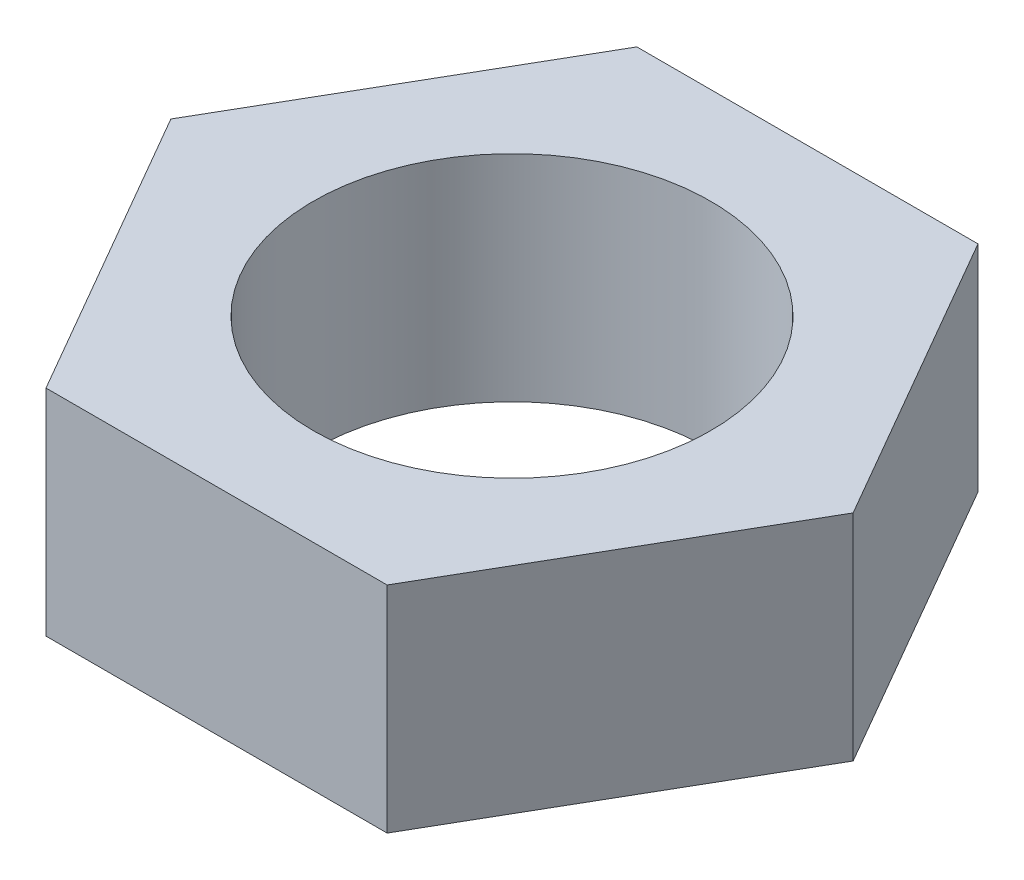
ISO-10303-21;
HEADER;
FILE_DESCRIPTION(('STEP AP214'),'2;1');
FILE_NAME('part.step','',(''),(''),'','','');
FILE_SCHEMA(('AUTOMOTIVE_DESIGN { 1 0 10303 214 1 1 1 1 }'));
ENDSEC;
DATA;
#1=APPLICATION_CONTEXT('core data for automotive mechanical design processes');
#2=APPLICATION_PROTOCOL_DEFINITION('international standard','automotive_design',2000,#1);
#3=PRODUCT_CONTEXT('',#1,'mechanical');
#4=PRODUCT('Part','Part','',(#3));
#5=PRODUCT_RELATED_PRODUCT_CATEGORY('part','',(#4));
#6=PRODUCT_DEFINITION_FORMATION('','',#4);
#7=PRODUCT_DEFINITION_CONTEXT('part definition',#1,'design');
#8=PRODUCT_DEFINITION('design','',#6,#7);
#9=PRODUCT_DEFINITION_SHAPE('','',#8);
#10=(LENGTH_UNIT() NAMED_UNIT(*) SI_UNIT(.MILLI.,.METRE.));
#11=(NAMED_UNIT(*) PLANE_ANGLE_UNIT() SI_UNIT($,.RADIAN.));
#12=(NAMED_UNIT(*) SI_UNIT($,.STERADIAN.) SOLID_ANGLE_UNIT());
#13=UNCERTAINTY_MEASURE_WITH_UNIT(LENGTH_MEASURE(1.E-05),#10,'distance_accuracy_value','');
#14=(GEOMETRIC_REPRESENTATION_CONTEXT(3) GLOBAL_UNCERTAINTY_ASSIGNED_CONTEXT((#13)) GLOBAL_UNIT_ASSIGNED_CONTEXT((#10,
#11,#12)) REPRESENTATION_CONTEXT('',''));
#15=CARTESIAN_POINT('',(0.,0.,0.));
#16=DIRECTION('',(0.,0.,1.));
#17=DIRECTION('',(1.,0.,0.));
#18=AXIS2_PLACEMENT_3D('',#15,#16,#17);
#19=CARTESIAN_POINT('',(0.,2.,0.));
#20=DIRECTION('',(0.,1.,0.));
#21=DIRECTION('',(0.,0.,1.));
#22=AXIS2_PLACEMENT_3D('',#19,#20,#21);
#23=PLANE('',#22);
#24=DIRECTION('',(0.5,0.,-0.866025403784439));
#25=VECTOR('',#24,1.);
#26=CARTESIAN_POINT('',(1.58771324027147,2.,2.75));
#27=LINE('',#26,#25);
#28=CARTESIAN_POINT('',(1.58771324027147,2.,2.75));
#29=VERTEX_POINT('',#28);
#30=CARTESIAN_POINT('',(3.17542648054294,2.,0.));
#31=VERTEX_POINT('',#30);
#32=EDGE_CURVE('E152',#29,#31,#27,.T.);
#33=ORIENTED_EDGE('',*,*,#32,.T.);
#34=DIRECTION('',(-0.5,0.,-0.866025403784439));
#35=VECTOR('',#34,1.);
#36=CARTESIAN_POINT('',(3.17542648054294,2.,0.));
#37=LINE('',#36,#35);
#38=CARTESIAN_POINT('',(1.58771324027147,2.,-2.75));
#39=VERTEX_POINT('',#38);
#40=EDGE_CURVE('E100',#31,#39,#37,.T.);
#41=ORIENTED_EDGE('',*,*,#40,.T.);
#42=DIRECTION('',(-1.,0.,0.));
#43=VECTOR('',#42,1.);
#44=CARTESIAN_POINT('',(1.58771324027147,2.,-2.75));
#45=LINE('',#44,#43);
#46=CARTESIAN_POINT('',(-1.58771324027147,2.,-2.75));
#47=VERTEX_POINT('',#46);
#48=EDGE_CURVE('E113',#39,#47,#45,.T.);
#49=ORIENTED_EDGE('',*,*,#48,.T.);
#50=DIRECTION('',(-0.5,0.,0.866025403784439));
#51=VECTOR('',#50,1.);
#52=CARTESIAN_POINT('',(-1.58771324027147,2.,-2.75));
#53=LINE('',#52,#51);
#54=CARTESIAN_POINT('',(-3.17542648054294,2.,0.));
#55=VERTEX_POINT('',#54);
#56=EDGE_CURVE('E107',#47,#55,#53,.T.);
#57=ORIENTED_EDGE('',*,*,#56,.T.);
#58=DIRECTION('',(0.5,0.,0.866025403784439));
#59=VECTOR('',#58,1.);
#60=CARTESIAN_POINT('',(-3.17542648054294,2.,0.));
#61=LINE('',#60,#59);
#62=CARTESIAN_POINT('',(-1.58771324027147,2.,2.75));
#63=VERTEX_POINT('',#62);
#64=EDGE_CURVE('E111',#55,#63,#61,.T.);
#65=ORIENTED_EDGE('',*,*,#64,.T.);
#66=DIRECTION('',(1.,0.,0.));
#67=VECTOR('',#66,1.);
#68=CARTESIAN_POINT('',(-1.58771324027147,2.,2.75));
#69=LINE('',#68,#67);
#70=EDGE_CURVE('E63',#63,#29,#69,.T.);
#71=ORIENTED_EDGE('',*,*,#70,.T.);
#72=EDGE_LOOP('',(#33,#41,#49,#57,#65,#71));
#73=FACE_BOUND('',#72,.T.);
#74=CARTESIAN_POINT('',(0.,2.,0.));
#75=DIRECTION('',(0.,1.,0.));
#76=DIRECTION('',(0.,0.,1.));
#77=AXIS2_PLACEMENT_3D('',#74,#75,#76);
#78=CIRCLE('',#77,1.85);
#79=CARTESIAN_POINT('',(0.,2.,1.85));
#80=VERTEX_POINT('',#79);
#81=EDGE_CURVE('E140',#80,#80,#78,.T.);
#82=ORIENTED_EDGE('',*,*,#81,.F.);
#83=EDGE_LOOP('',(#82));
#84=FACE_BOUND('',#83,.T.);
#85=ADVANCED_FACE('F45',(#73,#84),#23,.T.);
#86=CARTESIAN_POINT('',(0.,0.,0.));
#87=DIRECTION('',(0.,1.,0.));
#88=DIRECTION('',(0.,0.,1.));
#89=AXIS2_PLACEMENT_3D('',#86,#87,#88);
#90=PLANE('',#89);
#91=DIRECTION('',(0.5,0.,-0.866025403784439));
#92=VECTOR('',#91,1.);
#93=CARTESIAN_POINT('',(1.58771324027147,0.,2.75));
#94=LINE('',#93,#92);
#95=CARTESIAN_POINT('',(1.58771324027147,0.,2.75));
#96=VERTEX_POINT('',#95);
#97=CARTESIAN_POINT('',(3.17542648054294,0.,0.));
#98=VERTEX_POINT('',#97);
#99=EDGE_CURVE('E135',#96,#98,#94,.T.);
#100=ORIENTED_EDGE('',*,*,#99,.F.);
#101=DIRECTION('',(1.,0.,0.));
#102=VECTOR('',#101,1.);
#103=CARTESIAN_POINT('',(-1.58771324027147,0.,2.75));
#104=LINE('',#103,#102);
#105=CARTESIAN_POINT('',(-1.58771324027147,0.,2.75));
#106=VERTEX_POINT('',#105);
#107=EDGE_CURVE('E92',#106,#96,#104,.T.);
#108=ORIENTED_EDGE('',*,*,#107,.F.);
#109=DIRECTION('',(0.5,0.,0.866025403784439));
#110=VECTOR('',#109,1.);
#111=CARTESIAN_POINT('',(-3.17542648054294,0.,0.));
#112=LINE('',#111,#110);
#113=CARTESIAN_POINT('',(-3.17542648054294,0.,0.));
#114=VERTEX_POINT('',#113);
#115=EDGE_CURVE('E86',#114,#106,#112,.T.);
#116=ORIENTED_EDGE('',*,*,#115,.F.);
#117=DIRECTION('',(-0.5,0.,0.866025403784439));
#118=VECTOR('',#117,1.);
#119=CARTESIAN_POINT('',(-1.58771324027147,0.,-2.75));
#120=LINE('',#119,#118);
#121=CARTESIAN_POINT('',(-1.58771324027147,0.,-2.75));
#122=VERTEX_POINT('',#121);
#123=EDGE_CURVE('E122',#122,#114,#120,.T.);
#124=ORIENTED_EDGE('',*,*,#123,.F.);
#125=DIRECTION('',(-1.,0.,0.));
#126=VECTOR('',#125,1.);
#127=CARTESIAN_POINT('',(1.58771324027147,0.,-2.75));
#128=LINE('',#127,#126);
#129=CARTESIAN_POINT('',(1.58771324027147,0.,-2.75));
#130=VERTEX_POINT('',#129);
#131=EDGE_CURVE('E143',#130,#122,#128,.T.);
#132=ORIENTED_EDGE('',*,*,#131,.F.);
#133=DIRECTION('',(-0.5,0.,-0.866025403784439));
#134=VECTOR('',#133,1.);
#135=CARTESIAN_POINT('',(3.17542648054294,0.,0.));
#136=LINE('',#135,#134);
#137=EDGE_CURVE('E139',#98,#130,#136,.T.);
#138=ORIENTED_EDGE('',*,*,#137,.F.);
#139=EDGE_LOOP('',(#100,#108,#116,#124,#132,#138));
#140=FACE_BOUND('',#139,.T.);
#141=CARTESIAN_POINT('',(0.,0.,0.));
#142=DIRECTION('',(0.,1.,0.));
#143=DIRECTION('',(0.,0.,1.));
#144=AXIS2_PLACEMENT_3D('',#141,#142,#143);
#145=CIRCLE('',#144,1.85);
#146=CARTESIAN_POINT('',(0.,0.,1.85));
#147=VERTEX_POINT('',#146);
#148=EDGE_CURVE('E249',#147,#147,#145,.T.);
#149=ORIENTED_EDGE('',*,*,#148,.T.);
#150=EDGE_LOOP('',(#149));
#151=FACE_BOUND('',#150,.T.);
#152=ADVANCED_FACE('F165',(#140,#151),#90,.F.);
#153=CARTESIAN_POINT('',(1.58771324027147,2.,2.75));
#154=DIRECTION('',(-0.866025403784439,0.,-0.5));
#155=DIRECTION('',(-0.5,0.,0.866025403784439));
#156=AXIS2_PLACEMENT_3D('',#153,#154,#155);
#157=PLANE('',#156);
#158=ORIENTED_EDGE('',*,*,#99,.T.);
#159=DIRECTION('',(0.,-1.,0.));
#160=VECTOR('',#159,1.);
#161=CARTESIAN_POINT('',(3.17542648054294,2.,0.));
#162=LINE('',#161,#160);
#163=EDGE_CURVE('E11',#31,#98,#162,.T.);
#164=ORIENTED_EDGE('',*,*,#163,.F.);
#165=ORIENTED_EDGE('',*,*,#32,.F.);
#166=DIRECTION('',(0.,-1.,0.));
#167=VECTOR('',#166,1.);
#168=CARTESIAN_POINT('',(1.58771324027147,2.,2.75));
#169=LINE('',#168,#167);
#170=EDGE_CURVE('E131',#29,#96,#169,.T.);
#171=ORIENTED_EDGE('',*,*,#170,.T.);
#172=EDGE_LOOP('',(#158,#164,#165,#171));
#173=FACE_BOUND('',#172,.T.);
#174=ADVANCED_FACE('F47',(#173),#157,.F.);
#175=CARTESIAN_POINT('',(3.17542648054294,2.,0.));
#176=DIRECTION('',(-0.866025403784439,0.,0.5));
#177=DIRECTION('',(0.5,0.,0.866025403784439));
#178=AXIS2_PLACEMENT_3D('',#175,#176,#177);
#179=PLANE('',#178);
#180=ORIENTED_EDGE('',*,*,#137,.T.);
#181=DIRECTION('',(0.,-1.,0.));
#182=VECTOR('',#181,1.);
#183=CARTESIAN_POINT('',(1.58771324027147,2.,-2.75));
#184=LINE('',#183,#182);
#185=EDGE_CURVE('E55',#39,#130,#184,.T.);
#186=ORIENTED_EDGE('',*,*,#185,.F.);
#187=ORIENTED_EDGE('',*,*,#40,.F.);
#188=ORIENTED_EDGE('',*,*,#163,.T.);
#189=EDGE_LOOP('',(#180,#186,#187,#188));
#190=FACE_BOUND('',#189,.T.);
#191=ADVANCED_FACE('F190',(#190),#179,.F.);
#192=CARTESIAN_POINT('',(1.58771324027147,2.,-2.75));
#193=DIRECTION('',(0.,0.,1.));
#194=DIRECTION('',(1.,0.,0.));
#195=AXIS2_PLACEMENT_3D('',#192,#193,#194);
#196=PLANE('',#195);
#197=ORIENTED_EDGE('',*,*,#131,.T.);
#198=DIRECTION('',(0.,-1.,0.));
#199=VECTOR('',#198,1.);
#200=CARTESIAN_POINT('',(-1.58771324027147,2.,-2.75));
#201=LINE('',#200,#199);
#202=EDGE_CURVE('E124',#47,#122,#201,.T.);
#203=ORIENTED_EDGE('',*,*,#202,.F.);
#204=ORIENTED_EDGE('',*,*,#48,.F.);
#205=ORIENTED_EDGE('',*,*,#185,.T.);
#206=EDGE_LOOP('',(#197,#203,#204,#205));
#207=FACE_BOUND('',#206,.T.);
#208=ADVANCED_FACE('F162',(#207),#196,.F.);
#209=CARTESIAN_POINT('',(-1.58771324027147,2.,-2.75));
#210=DIRECTION('',(0.866025403784439,0.,0.5));
#211=DIRECTION('',(0.5,0.,-0.866025403784439));
#212=AXIS2_PLACEMENT_3D('',#209,#210,#211);
#213=PLANE('',#212);
#214=ORIENTED_EDGE('',*,*,#123,.T.);
#215=DIRECTION('',(0.,-1.,0.));
#216=VECTOR('',#215,1.);
#217=CARTESIAN_POINT('',(-3.17542648054294,2.,0.));
#218=LINE('',#217,#216);
#219=EDGE_CURVE('E119',#55,#114,#218,.T.);
#220=ORIENTED_EDGE('',*,*,#219,.F.);
#221=ORIENTED_EDGE('',*,*,#56,.F.);
#222=ORIENTED_EDGE('',*,*,#202,.T.);
#223=EDGE_LOOP('',(#214,#220,#221,#222));
#224=FACE_BOUND('',#223,.T.);
#225=ADVANCED_FACE('F120',(#224),#213,.F.);
#226=CARTESIAN_POINT('',(-3.17542648054294,2.,0.));
#227=DIRECTION('',(0.866025403784439,0.,-0.5));
#228=DIRECTION('',(-0.5,0.,-0.866025403784439));
#229=AXIS2_PLACEMENT_3D('',#226,#227,#228);
#230=PLANE('',#229);
#231=ORIENTED_EDGE('',*,*,#115,.T.);
#232=DIRECTION('',(0.,-1.,0.));
#233=VECTOR('',#232,1.);
#234=CARTESIAN_POINT('',(-1.58771324027147,2.,2.75));
#235=LINE('',#234,#233);
#236=EDGE_CURVE('E125',#63,#106,#235,.T.);
#237=ORIENTED_EDGE('',*,*,#236,.F.);
#238=ORIENTED_EDGE('',*,*,#64,.F.);
#239=ORIENTED_EDGE('',*,*,#219,.T.);
#240=EDGE_LOOP('',(#231,#237,#238,#239));
#241=FACE_BOUND('',#240,.T.);
#242=ADVANCED_FACE('F127',(#241),#230,.F.);
#243=CARTESIAN_POINT('',(-1.58771324027147,2.,2.75));
#244=DIRECTION('',(0.,0.,-1.));
#245=DIRECTION('',(-1.,0.,0.));
#246=AXIS2_PLACEMENT_3D('',#243,#244,#245);
#247=PLANE('',#246);
#248=ORIENTED_EDGE('',*,*,#107,.T.);
#249=ORIENTED_EDGE('',*,*,#170,.F.);
#250=ORIENTED_EDGE('',*,*,#70,.F.);
#251=ORIENTED_EDGE('',*,*,#236,.T.);
#252=EDGE_LOOP('',(#248,#249,#250,#251));
#253=FACE_BOUND('',#252,.T.);
#254=ADVANCED_FACE('F170',(#253),#247,.F.);
#255=CARTESIAN_POINT('',(0.,2.,0.));
#256=DIRECTION('',(0.,-1.,0.));
#257=DIRECTION('',(0.,0.,-1.));
#258=AXIS2_PLACEMENT_3D('',#255,#256,#257);
#259=CYLINDRICAL_SURFACE('',#258,1.85);
#260=ORIENTED_EDGE('',*,*,#81,.T.);
#261=EDGE_LOOP('',(#260));
#262=FACE_BOUND('',#261,.T.);
#263=ORIENTED_EDGE('',*,*,#148,.F.);
#264=EDGE_LOOP('',(#263));
#265=FACE_BOUND('',#264,.T.);
#266=ADVANCED_FACE('F172',(#262,#265),#259,.F.);
#267=CLOSED_SHELL('',(#85,#152,#174,#191,#208,#225,#242,#254,#266));
#268=MANIFOLD_SOLID_BREP('B2',#267);
#269=ADVANCED_BREP_SHAPE_REPRESENTATION('',(#18,#268),#14);
#270=SHAPE_DEFINITION_REPRESENTATION(#9,#269);
ENDSEC;
END-ISO-10303-21;
